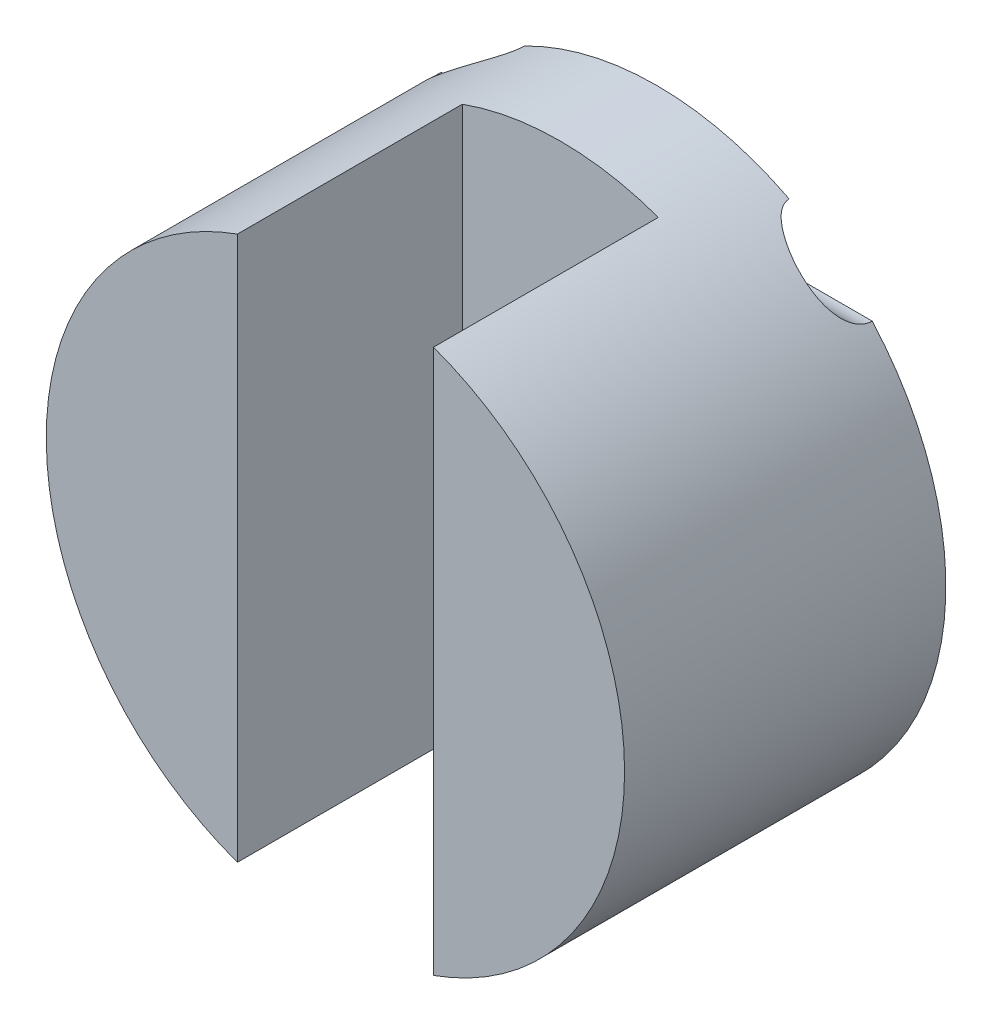
ISO-10303-21;
HEADER;
FILE_DESCRIPTION(('STEP AP214'),'2;1');
FILE_NAME('part.step','',(''),(''),'','','');
FILE_SCHEMA(('AUTOMOTIVE_DESIGN { 1 0 10303 214 1 1 1 1 }'));
ENDSEC;
DATA;
#1=APPLICATION_CONTEXT('core data for automotive mechanical design processes');
#2=APPLICATION_PROTOCOL_DEFINITION('international standard','automotive_design',2000,#1);
#3=PRODUCT_CONTEXT('',#1,'mechanical');
#4=PRODUCT('Part','Part','',(#3));
#5=PRODUCT_RELATED_PRODUCT_CATEGORY('part','',(#4));
#6=PRODUCT_DEFINITION_FORMATION('','',#4);
#7=PRODUCT_DEFINITION_CONTEXT('part definition',#1,'design');
#8=PRODUCT_DEFINITION('design','',#6,#7);
#9=PRODUCT_DEFINITION_SHAPE('','',#8);
#10=(LENGTH_UNIT() NAMED_UNIT(*) SI_UNIT(.MILLI.,.METRE.));
#11=(NAMED_UNIT(*) PLANE_ANGLE_UNIT() SI_UNIT($,.RADIAN.));
#12=(NAMED_UNIT(*) SI_UNIT($,.STERADIAN.) SOLID_ANGLE_UNIT());
#13=UNCERTAINTY_MEASURE_WITH_UNIT(LENGTH_MEASURE(1.E-05),#10,'distance_accuracy_value','');
#14=(GEOMETRIC_REPRESENTATION_CONTEXT(3) GLOBAL_UNCERTAINTY_ASSIGNED_CONTEXT((#13)) GLOBAL_UNIT_ASSIGNED_CONTEXT((#10,
#11,#12)) REPRESENTATION_CONTEXT('',''));
#15=CARTESIAN_POINT('',(0.,0.,0.));
#16=DIRECTION('',(0.,0.,1.));
#17=DIRECTION('',(1.,0.,0.));
#18=AXIS2_PLACEMENT_3D('',#15,#16,#17);
#19=CARTESIAN_POINT('',(0.,0.,0.));
#20=DIRECTION('',(0.,0.,1.));
#21=DIRECTION('',(1.,0.,0.));
#22=AXIS2_PLACEMENT_3D('',#19,#20,#21);
#23=PLANE('',#22);
#24=CARTESIAN_POINT('',(0.,0.,0.));
#25=DIRECTION('',(0.,0.,1.));
#26=DIRECTION('',(1.,0.,0.));
#27=AXIS2_PLACEMENT_3D('',#24,#25,#26);
#28=CIRCLE('',#27,90.);
#29=CARTESIAN_POINT('',(-67.0820393249937,60.,0.));
#30=VERTEX_POINT('',#29);
#31=CARTESIAN_POINT('',(67.0820393249937,60.,0.));
#32=VERTEX_POINT('',#31);
#33=EDGE_CURVE('E101',#30,#32,#28,.T.);
#34=ORIENTED_EDGE('',*,*,#33,.F.);
#35=DIRECTION('',(1.,0.,0.));
#36=VECTOR('',#35,1.);
#37=CARTESIAN_POINT('',(-200.,60.,0.));
#38=LINE('',#37,#36);
#39=EDGE_CURVE('E11',#30,#32,#38,.T.);
#40=ORIENTED_EDGE('',*,*,#39,.T.);
#41=EDGE_LOOP('',(#34,#40));
#42=FACE_BOUND('',#41,.T.);
#43=ADVANCED_FACE('F39',(#42),#23,.F.);
#44=CARTESIAN_POINT('',(0.,0.,100.));
#45=DIRECTION('',(0.,0.,1.));
#46=DIRECTION('',(1.,0.,0.));
#47=AXIS2_PLACEMENT_3D('',#44,#45,#46);
#48=PLANE('',#47);
#49=CARTESIAN_POINT('',(0.,0.,100.));
#50=DIRECTION('',(0.,0.,1.));
#51=DIRECTION('',(1.,0.,0.));
#52=AXIS2_PLACEMENT_3D('',#49,#50,#51);
#53=CIRCLE('',#52,90.);
#54=CARTESIAN_POINT('',(-30.5,84.6743762894065,100.));
#55=VERTEX_POINT('',#54);
#56=CARTESIAN_POINT('',(-30.5,-84.6743762894065,100.));
#57=VERTEX_POINT('',#56);
#58=EDGE_CURVE('E107',#55,#57,#53,.T.);
#59=ORIENTED_EDGE('',*,*,#58,.T.);
#60=DIRECTION('',(0.,1.,0.));
#61=VECTOR('',#60,1.);
#62=CARTESIAN_POINT('',(-30.5,-200.,100.));
#63=LINE('',#62,#61);
#64=EDGE_CURVE('E116',#57,#55,#63,.T.);
#65=ORIENTED_EDGE('',*,*,#64,.T.);
#66=EDGE_LOOP('',(#59,#65));
#67=FACE_BOUND('',#66,.T.);
#68=ADVANCED_FACE('F147',(#67),#48,.T.);
#69=CARTESIAN_POINT('',(0.,0.,100.));
#70=DIRECTION('',(0.,0.,-1.));
#71=DIRECTION('',(-1.,0.,0.));
#72=AXIS2_PLACEMENT_3D('',#69,#70,#71);
#73=CYLINDRICAL_SURFACE('',#72,90.);
#74=CARTESIAN_POINT('',(0.,0.,30.));
#75=DIRECTION('',(0.,0.,-1.));
#76=DIRECTION('',(-1.,0.,0.));
#77=AXIS2_PLACEMENT_3D('',#74,#75,#76);
#78=CIRCLE('',#77,90.);
#79=CARTESIAN_POINT('',(-30.5,84.6743762894065,30.));
#80=VERTEX_POINT('',#79);
#81=CARTESIAN_POINT('',(30.5,84.6743762894065,30.));
#82=VERTEX_POINT('',#81);
#83=EDGE_CURVE('E96',#80,#82,#78,.T.);
#84=ORIENTED_EDGE('',*,*,#83,.T.);
#85=DIRECTION('',(0.,0.,-1.));
#86=VECTOR('',#85,1.);
#87=CARTESIAN_POINT('',(30.5,84.6743762894065,100.));
#88=LINE('',#87,#86);
#89=CARTESIAN_POINT('',(30.5,84.6743762894065,100.));
#90=VERTEX_POINT('',#89);
#91=EDGE_CURVE('E142',#82,#90,#88,.F.);
#92=ORIENTED_EDGE('',*,*,#91,.T.);
#93=CARTESIAN_POINT('',(30.5,-84.6743762894065,100.));
#94=VERTEX_POINT('',#93);
#95=EDGE_CURVE('E104',#94,#90,#53,.T.);
#96=ORIENTED_EDGE('',*,*,#95,.F.);
#97=DIRECTION('',(0.,0.,-1.));
#98=VECTOR('',#97,1.);
#99=CARTESIAN_POINT('',(30.5,-84.6743762894065,100.));
#100=LINE('',#99,#98);
#101=CARTESIAN_POINT('',(30.5,-84.6743762894065,30.));
#102=VERTEX_POINT('',#101);
#103=EDGE_CURVE('E109',#94,#102,#100,.T.);
#104=ORIENTED_EDGE('',*,*,#103,.T.);
#105=CARTESIAN_POINT('',(-30.5,-84.6743762894065,30.));
#106=VERTEX_POINT('',#105);
#107=EDGE_CURVE('E114',#102,#106,#78,.T.);
#108=ORIENTED_EDGE('',*,*,#107,.T.);
#109=DIRECTION('',(0.,0.,-1.));
#110=VECTOR('',#109,1.);
#111=CARTESIAN_POINT('',(-30.5,-84.6743762894065,100.));
#112=LINE('',#111,#110);
#113=EDGE_CURVE('E131',#106,#57,#112,.F.);
#114=ORIENTED_EDGE('',*,*,#113,.T.);
#115=ORIENTED_EDGE('',*,*,#58,.F.);
#116=DIRECTION('',(0.,0.,-1.));
#117=VECTOR('',#116,1.);
#118=CARTESIAN_POINT('',(-30.5,84.6743762894065,100.));
#119=LINE('',#118,#117);
#120=EDGE_CURVE('E138',#55,#80,#119,.T.);
#121=ORIENTED_EDGE('',*,*,#120,.T.);
#122=EDGE_LOOP('',(#84,#92,#96,#104,#108,#114,#115,#121));
#123=FACE_BOUND('',#122,.T.);
#124=ORIENTED_EDGE('',*,*,#33,.T.);
#125=CARTESIAN_POINT('',(67.0820393249937,60.,0.));
#126=CARTESIAN_POINT('',(67.0820400660239,59.999998620481,0.114225035064845));
#127=CARTESIAN_POINT('',(67.0802884191229,60.0019576394621,0.228433501595897));
#128=CARTESIAN_POINT('',(67.0732928725613,60.0097777309474,0.456604524815152));
#129=CARTESIAN_POINT('',(67.0680491317635,60.0156386259469,0.570567092453229));
#130=CARTESIAN_POINT('',(67.0471092976049,60.0390340066079,0.911603492596775));
#131=CARTESIAN_POINT('',(67.0262045501936,60.0623812492509,1.1380063555372));
#132=CARTESIAN_POINT('',(66.9710025431974,60.1239261716919,1.58551861329466));
#133=CARTESIAN_POINT('',(66.936795625217,60.1620236677563,1.80665325700858));
#134=CARTESIAN_POINT('',(66.8554698602543,60.2523845081803,2.24360511767028));
#135=CARTESIAN_POINT('',(66.8083498548856,60.3046491234163,2.45942185567403));
#136=CARTESIAN_POINT('',(66.7019458857898,60.4223194101804,2.8838223157085));
#137=CARTESIAN_POINT('',(66.6426881157387,60.4876967777638,3.09242050099975));
#138=CARTESIAN_POINT('',(66.5126497251385,60.6306585796549,3.50178116453596));
#139=CARTESIAN_POINT('',(66.4418640479636,60.7082483703433,3.70254015605266));
#140=CARTESIAN_POINT('',(66.2894893747349,60.8745950680717,4.09543036557693));
#141=CARTESIAN_POINT('',(66.207887624767,60.9633651522508,4.28755103377674));
#142=CARTESIAN_POINT('',(66.0347587869414,61.1508537988421,4.66224428671932));
#143=CARTESIAN_POINT('',(65.9432296840185,61.2495743807288,4.84481492179625));
#144=CARTESIAN_POINT('',(65.7199312905079,61.4892300124375,5.25743915088227));
#145=CARTESIAN_POINT('',(65.5847299811361,61.633482175383,5.48372118769969));
#146=CARTESIAN_POINT('',(65.3001895155557,61.9348707648226,5.91807581664422));
#147=CARTESIAN_POINT('',(65.150846623438,62.0920105944914,6.12614356884472));
#148=CARTESIAN_POINT('',(64.8395395343311,62.4170232415814,6.52415158207974));
#149=CARTESIAN_POINT('',(64.6775598336816,62.5849091962554,6.71406891896552));
#150=CARTESIAN_POINT('',(64.3426902882602,62.9291340757124,7.07567573695657));
#151=CARTESIAN_POINT('',(64.1697999063252,63.1054734165763,7.24736431949172));
#152=CARTESIAN_POINT('',(63.7488787720034,63.5310940928977,7.63304811924041));
#153=CARTESIAN_POINT('',(63.496658608991,63.7832843449085,7.83928289408708));
#154=CARTESIAN_POINT('',(62.9773001015166,64.2961354234377,8.21997508950729));
#155=CARTESIAN_POINT('',(62.7101565686157,64.5567991826231,8.39442136713383));
#156=CARTESIAN_POINT('',(62.1632380397577,65.0836085575994,8.71343788753071));
#157=CARTESIAN_POINT('',(61.8834515347715,65.3497590431126,8.85798021257732));
#158=CARTESIAN_POINT('',(61.3135822902038,65.8847290182724,9.11883264328539));
#159=CARTESIAN_POINT('',(61.0234993834274,66.1535485512083,9.23514229025906));
#160=CARTESIAN_POINT('',(60.3061380692184,66.8094129061907,9.48639518438105));
#161=CARTESIAN_POINT('',(59.8742554253211,67.1968327858514,9.60730307972423));
#162=CARTESIAN_POINT('',(58.9968168879363,67.9685036266233,9.79955210221079));
#163=CARTESIAN_POINT('',(58.5512552797267,68.3527531758029,9.87087221031998));
#164=CARTESIAN_POINT('',(57.6488362909565,69.1155657939003,9.96824550621856));
#165=CARTESIAN_POINT('',(57.1919563763531,69.4941146191259,9.99419954282841));
#166=CARTESIAN_POINT('',(56.2706431033015,70.2422032058557,10.0040621744165));
#167=CARTESIAN_POINT('',(55.8062102154169,70.6117435250482,9.98797337884047));
#168=CARTESIAN_POINT('',(54.7404462158951,71.4426975938115,9.90649650815334));
#169=CARTESIAN_POINT('',(54.1373687759484,71.9007018720126,9.82850953593709));
#170=CARTESIAN_POINT('',(53.2296440355507,72.5723584519497,9.66622939806979));
#171=CARTESIAN_POINT('',(52.9264402235128,72.7937633741896,9.6045554025484));
#172=CARTESIAN_POINT('',(52.3195355805533,73.2311816765751,9.46636584245038));
#173=CARTESIAN_POINT('',(52.0158348055084,73.447195623698,9.3898518461074));
#174=CARTESIAN_POINT('',(51.4089892240517,73.8732231059098,9.22228048059452));
#175=CARTESIAN_POINT('',(51.1058442876157,74.083245451383,9.13124591712652));
#176=CARTESIAN_POINT('',(50.5002840899399,74.4973544805346,8.93455893095835));
#177=CARTESIAN_POINT('',(50.1978687588197,74.7014417551884,8.8289079697365));
#178=CARTESIAN_POINT('',(49.5946308629443,75.1032878740664,8.60288129333098));
#179=CARTESIAN_POINT('',(49.2938074229158,75.3010505834691,8.48251479702558));
#180=CARTESIAN_POINT('',(48.6943647147471,75.6900687617402,8.22662328789124));
#181=CARTESIAN_POINT('',(48.3957455880706,75.8813238157687,8.0910973110518));
#182=CARTESIAN_POINT('',(47.8005496923594,76.2576678207183,7.80370948244807));
#183=CARTESIAN_POINT('',(47.5039857417649,76.442729271287,7.65178490022325));
#184=CARTESIAN_POINT('',(46.9154383579287,76.8053452768251,7.33115609194495));
#185=CARTESIAN_POINT('',(46.6234540119269,76.9829013399643,7.16245526005631));
#186=CARTESIAN_POINT('',(46.0457044534572,77.3298559723198,6.80697486854522));
#187=CARTESIAN_POINT('',(45.7599387743035,77.4992551548421,6.62019667132655));
#188=CARTESIAN_POINT('',(45.1969092507825,77.8289515476804,6.22682941686307));
#189=CARTESIAN_POINT('',(44.9196436027111,77.989250695257,6.02024460152006));
#190=CARTESIAN_POINT('',(44.4449795892877,78.2604540420438,5.63958491867128));
#191=CARTESIAN_POINT('',(44.245003727567,78.3736567493264,5.47036651858896));
#192=CARTESIAN_POINT('',(43.8534693304265,78.59340681766,5.11824783491197));
#193=CARTESIAN_POINT('',(43.6619123131875,78.6999529797761,4.93534509954372));
#194=CARTESIAN_POINT('',(43.2900296373246,78.9051224181552,4.55471919619959));
#195=CARTESIAN_POINT('',(43.1096896749057,79.0037558331697,4.3570156420305));
#196=CARTESIAN_POINT('',(42.7635829151964,79.1916330209633,3.94526262625944));
#197=CARTESIAN_POINT('',(42.5978063065661,79.2808831233864,3.73122435387198));
#198=CARTESIAN_POINT('',(42.2640455471191,79.4593658512651,3.25476832193036));
#199=CARTESIAN_POINT('',(42.098818087559,79.5469505913296,2.98972768149801));
#200=CARTESIAN_POINT('',(41.8769648435927,79.663836583702,2.57502879402555));
#201=CARTESIAN_POINT('',(41.8074512692724,79.7003284428864,2.43421954749586));
#202=CARTESIAN_POINT('',(41.6782844075574,79.7679503416652,2.14684159247524));
#203=CARTESIAN_POINT('',(41.6186314522315,79.7990802006889,2.00027269022629));
#204=CARTESIAN_POINT('',(41.5119934374888,79.8546050268747,1.70548919647641));
#205=CARTESIAN_POINT('',(41.4647354604286,79.8791454369535,1.55740142318812));
#206=CARTESIAN_POINT('',(41.3823806351003,79.9218412772265,1.25701239696542));
#207=CARTESIAN_POINT('',(41.347279126666,79.9399991541964,1.10471278286617));
#208=CARTESIAN_POINT('',(41.2899987767469,79.969601254671,0.79471195601189));
#209=CARTESIAN_POINT('',(41.268015559652,79.9809438629328,0.636964380509906));
#210=CARTESIAN_POINT('',(41.2384828026067,79.9961723982912,0.319501413289932));
#211=CARTESIAN_POINT('',(41.2309583730552,80.0000453529751,0.159783082090832));
#212=CARTESIAN_POINT('',(41.2310562561767,80.,0.));
#213=B_SPLINE_CURVE_WITH_KNOTS('',3,(#125,#126,#127,#128,#129,#130,#131,#132,#133,#134,#135,
#136,#137,#138,#139,#140,#141,#142,#143,#144,#145,#146,#147,#148,#149,#150,#151,#152,#153,#154,
#155,#156,#157,#158,#159,#160,#161,#162,#163,#164,#165,#166,#167,#168,#169,#170,#171,#172,#173,
#174,#175,#176,#177,#178,#179,#180,#181,#182,#183,#184,#185,#186,#187,#188,#189,#190,#191,#192,
#193,#194,#195,#196,#197,#198,#199,#200,#201,#202,#203,#204,#205,#206,#207,#208,#209,#210,#211,
#212),.UNSPECIFIED.,.F.,.F.,(4,2,2,2,2,2,2,2,2,2,2,2,2,2,2,2,2,2,2,2,2,2,2,2,2,2,2,2,2,2,2,2,2,
2,2,2,2,2,2,2,2,2,2,4),(0.,0.34261207253373,0.685208559976934,1.36986259177066,2.04994579862668,
2.73009003326566,3.40878167365123,4.08777182262783,4.76756985523044,5.44750613314114,
6.34765053716123,7.24803340740943,8.14953884360003,9.05108869808257,10.2852495692864,
11.5198422270393,12.7555823255498,13.9913424994128,15.7666338948827,17.5426773343773,
19.3225976279864,21.1024074510362,23.3830595867078,24.5242157378038,25.6652513615902,
26.8045122315468,27.9436592702204,29.0820962867163,30.2206057390608,31.3636360474641,
32.50643556707,33.6491490263587,34.7916182997722,35.6473050904633,36.5031455603421,
37.3578713037332,38.2120167298134,39.1821407996878,39.6653935365124,40.1486625441692,
40.6201726648311,41.0915018321148,41.569694534421,42.0487169602061),.UNSPECIFIED.);
#214=CARTESIAN_POINT('',(41.2310562561767,80.,0.));
#215=VERTEX_POINT('',#214);
#216=EDGE_CURVE('E95',#32,#215,#213,.T.);
#217=ORIENTED_EDGE('',*,*,#216,.T.);
#218=CARTESIAN_POINT('',(-41.2310562561767,80.,0.));
#219=VERTEX_POINT('',#218);
#220=EDGE_CURVE('E97',#215,#219,#28,.T.);
#221=ORIENTED_EDGE('',*,*,#220,.T.);
#222=CARTESIAN_POINT('',(-41.2310562561767,80.,0.));
#223=CARTESIAN_POINT('',(-41.2309934223305,80.0000291109476,0.142292686186409));
#224=CARTESIAN_POINT('',(-41.2369466310305,79.9969641221751,0.284548111703229));
#225=CARTESIAN_POINT('',(-41.260402143724,79.9848706131342,0.567673129081295));
#226=CARTESIAN_POINT('',(-41.2778898499346,79.9758496306139,0.708544244486921));
#227=CARTESIAN_POINT('',(-41.3236492760466,79.9522146207502,0.986229192660772));
#228=CARTESIAN_POINT('',(-41.3517851487204,79.9376710420597,1.1230716467204));
#229=CARTESIAN_POINT('',(-41.4180685033846,79.903347868885,1.39366603921261));
#230=CARTESIAN_POINT('',(-41.4562196229713,79.8835663719356,1.5274168354929));
#231=CARTESIAN_POINT('',(-41.5531315576692,79.8332072668629,1.82670516266522));
#232=CARTESIAN_POINT('',(-41.614675760115,79.8011568425857,1.99109508693105));
#233=CARTESIAN_POINT('',(-41.7504565193788,79.7302028332602,2.31308767695858));
#234=CARTESIAN_POINT('',(-41.8247028236871,79.6912939844117,2.47068501299107));
#235=CARTESIAN_POINT('',(-41.9843230878408,79.6073161032318,2.77942444700185));
#236=CARTESIAN_POINT('',(-42.069749973833,79.5622177183564,2.93053098934989));
#237=CARTESIAN_POINT('',(-42.2496742088051,79.4668195846048,3.22542054758093));
#238=CARTESIAN_POINT('',(-42.3441695839076,79.416520967445,3.3692051468003));
#239=CARTESIAN_POINT('',(-42.6054617098821,79.2767852172252,3.74205777273961));
#240=CARTESIAN_POINT('',(-42.7789173749531,79.1833736242174,3.96498415626675));
#241=CARTESIAN_POINT('',(-43.1413857406401,78.9864765771794,4.39303856105857));
#242=CARTESIAN_POINT('',(-43.3304092170238,78.8829841361534,4.59815404872315));
#243=CARTESIAN_POINT('',(-43.7203289065219,78.6675442419709,4.99241181914899));
#244=CARTESIAN_POINT('',(-43.9212379146695,78.5555876395646,5.18153633517056));
#245=CARTESIAN_POINT('',(-44.3320202475281,78.3245016764642,5.54518658955881));
#246=CARTESIAN_POINT('',(-44.5418968928265,78.2053696520073,5.71970684815895));
#247=CARTESIAN_POINT('',(-44.9578111944897,77.9669787381957,6.04699436875872));
#248=CARTESIAN_POINT('',(-45.1635138455109,77.8480256106313,6.20041354361387));
#249=CARTESIAN_POINT('',(-45.5797649313327,77.6050456257622,6.49614462645914));
#250=CARTESIAN_POINT('',(-45.7903126415054,77.4810195250424,6.63845818160546));
#251=CARTESIAN_POINT('',(-46.2154341411252,77.2281998479494,6.91288365075791));
#252=CARTESIAN_POINT('',(-46.4300109263704,77.0994026487443,7.04498756724807));
#253=CARTESIAN_POINT('',(-46.8622487432627,76.8374489682328,7.29949454270935));
#254=CARTESIAN_POINT('',(-47.0799101219768,76.704291994136,7.42189649967062));
#255=CARTESIAN_POINT('',(-47.7373936104566,76.2981436005104,7.7757757221572));
#256=CARTESIAN_POINT('',(-48.1809035561795,76.0189562798237,7.99340984790949));
#257=CARTESIAN_POINT('',(-49.0735453410805,75.4457992562794,8.39437159264375));
#258=CARTESIAN_POINT('',(-49.5226759032869,75.1518328669382,8.57770685840895));
#259=CARTESIAN_POINT('',(-50.2741021868027,74.6501545257922,8.85600115871079));
#260=CARTESIAN_POINT('',(-50.5755917989837,74.446244451497,8.96008206072248));
#261=CARTESIAN_POINT('',(-51.1792217685845,74.0325685685339,9.15371736875341));
#262=CARTESIAN_POINT('',(-51.4813621596649,73.8228024499147,9.24327100415215));
#263=CARTESIAN_POINT('',(-52.3880436140814,73.1849611506704,9.49021332774739));
#264=CARTESIAN_POINT('',(-52.9927326085011,72.7484179166268,9.62584202441259));
#265=CARTESIAN_POINT('',(-54.196805305428,71.8558799511855,9.83695432346602));
#266=CARTESIAN_POINT('',(-54.7961953244967,71.3999137346666,9.91252309741549));
#267=CARTESIAN_POINT('',(-55.9860488788765,70.470782218077,9.99979712845465));
#268=CARTESIAN_POINT('',(-56.5765170432115,69.99762630323,10.011536722748));
#269=CARTESIAN_POINT('',(-57.5536851264158,69.1941726921375,9.97274042779765));
#270=CARTESIAN_POINT('',(-57.9441715976591,68.8674871264889,9.94122527180783));
#271=CARTESIAN_POINT('',(-58.7171503883488,68.209629681846,9.84404080797369));
#272=CARTESIAN_POINT('',(-59.0996428573917,67.8784578869967,9.77837213986076));
#273=CARTESIAN_POINT('',(-59.8539637597739,67.2142490704432,9.6102450147125));
#274=CARTESIAN_POINT('',(-60.2258054921329,66.8812150564178,9.50783480963634));
#275=CARTESIAN_POINT('',(-60.9566866294279,66.2157556205556,9.26310512939506));
#276=CARTESIAN_POINT('',(-61.3157300806229,65.8833300384628,9.12079839620356));
#277=CARTESIAN_POINT('',(-61.9208803083468,65.3140608599588,8.83816705140133));
#278=CARTESIAN_POINT('',(-62.1708117185443,65.0761547373536,8.70813159512344));
#279=CARTESIAN_POINT('',(-62.6608094267294,64.6044774412756,8.42402086065315));
#280=CARTESIAN_POINT('',(-62.9008759870797,64.3707061579282,8.2699462223233));
#281=CARTESIAN_POINT('',(-63.3691536180385,63.9097663372074,7.93661649731635));
#282=CARTESIAN_POINT('',(-63.597374885059,63.6825921978055,7.7573835763162));
#283=CARTESIAN_POINT('',(-64.0400680024502,63.2373950901866,7.37249637957563));
#284=CARTESIAN_POINT('',(-64.2545436354611,63.0193696101156,7.16684941987826));
#285=CARTESIAN_POINT('',(-64.6176771747007,62.6466786941226,6.78102482355102));
#286=CARTESIAN_POINT('',(-64.7697641594313,62.4893799916475,6.60660617756043));
#287=CARTESIAN_POINT('',(-65.0633627566255,62.1836289365818,6.24187017949052));
#288=CARTESIAN_POINT('',(-65.204877020744,62.0351743677739,6.05155683935676));
#289=CARTESIAN_POINT('',(-65.4759175918412,61.7490327012508,5.65519589825045));
#290=CARTESIAN_POINT('',(-65.605452417243,61.6113379633313,5.44915967088827));
#291=CARTESIAN_POINT('',(-65.8511849114336,61.3486250418723,5.02161581274783));
#292=CARTESIAN_POINT('',(-65.9673849866525,61.2236045715719,4.80011098512304));
#293=CARTESIAN_POINT('',(-66.1663929690381,61.0084102990782,4.38142592638436));
#294=CARTESIAN_POINT('',(-66.2515172254814,60.9159283292289,4.18652973018672));
#295=CARTESIAN_POINT('',(-66.4106575052299,60.742394015474,3.78735644898964));
#296=CARTESIAN_POINT('',(-66.484675805271,60.6613393291663,3.58308129793323));
#297=CARTESIAN_POINT('',(-66.6206705528041,60.5119529876133,3.16636889391771));
#298=CARTESIAN_POINT('',(-66.6826630205246,60.4436044110412,2.95394295751295));
#299=CARTESIAN_POINT('',(-66.793932016195,60.3206228145942,2.52191732046285));
#300=CARTESIAN_POINT('',(-66.8432109573433,60.2659871918698,2.3023189901628));
#301=CARTESIAN_POINT('',(-66.9180767028548,60.1828325064433,1.91127320409118));
#302=CARTESIAN_POINT('',(-66.9465110593183,60.1511928599219,1.74102337416139));
#303=CARTESIAN_POINT('',(-66.9954477938968,60.0966830405396,1.39802004044536));
#304=CARTESIAN_POINT('',(-67.0159517374338,60.0738111369802,1.22526703776426));
#305=CARTESIAN_POINT('',(-67.0488924935903,60.0370440823063,0.877569136596811));
#306=CARTESIAN_POINT('',(-67.06130744088,60.0231732623858,0.702619589440734));
#307=CARTESIAN_POINT('',(-67.0778889046958,60.0046401965607,0.351783011293322));
#308=CARTESIAN_POINT('',(-67.0820524991947,59.9999812128177,0.175895670304776));
#309=CARTESIAN_POINT('',(-67.0820393249937,60.,0.));
#310=B_SPLINE_CURVE_WITH_KNOTS('',3,(#222,#223,#224,#225,#226,#227,#228,#229,#230,#231,#232,
#233,#234,#235,#236,#237,#238,#239,#240,#241,#242,#243,#244,#245,#246,#247,#248,#249,#250,#251,
#252,#253,#254,#255,#256,#257,#258,#259,#260,#261,#262,#263,#264,#265,#266,#267,#268,#269,#270,
#271,#272,#273,#274,#275,#276,#277,#278,#279,#280,#281,#282,#283,#284,#285,#286,#287,#288,#289,
#290,#291,#292,#293,#294,#295,#296,#297,#298,#299,#300,#301,#302,#303,#304,#305,#306,#307,#308,
#309),.UNSPECIFIED.,.F.,.F.,(4,2,2,2,2,2,2,2,2,2,2,2,2,2,2,2,2,2,2,2,2,2,2,2,2,2,2,2,2,2,2,2,2,
2,2,2,2,2,2,2,2,2,2,4),(0.,0.426661148264799,0.852783357859818,1.27364305733434,
1.69465582751007,2.22912921851404,2.76401461508028,3.30153037799494,3.83892940766819,
4.72996069488493,5.62161400718855,6.51424531637328,7.40721006815096,8.25540892406545,
9.10348173731226,9.95221227625675,10.8010390816374,12.5019117446118,14.2024047522701,
15.3377695295276,16.4731945142203,18.7444668950719,21.0125125865372,23.2793380514796,
24.8085659046742,26.3377651148465,27.8649633643645,29.3916744187258,30.4970957121206,
31.6024875869993,32.7069116002471,33.8110303720291,34.6497636100742,35.4882857813908,
36.3262070305154,37.1639768272069,37.859034927366,38.5539503444344,39.2479335742328,
39.9417849795976,40.4678487840081,40.9938086931173,41.5211844878547,42.0487470072719),.UNSPECIFIED.);
#311=EDGE_CURVE('E54',#219,#30,#310,.T.);
#312=ORIENTED_EDGE('',*,*,#311,.T.);
#313=EDGE_LOOP('',(#124,#217,#221,#312));
#314=FACE_BOUND('',#313,.T.);
#315=ADVANCED_FACE('F41',(#123,#314),#73,.T.);
#316=DIRECTION('',(0.,1.,0.));
#317=VECTOR('',#316,1.);
#318=CARTESIAN_POINT('',(30.5,-200.,100.));
#319=LINE('',#318,#317);
#320=EDGE_CURVE('E113',#94,#90,#319,.T.);
#321=ORIENTED_EDGE('',*,*,#320,.F.);
#322=ORIENTED_EDGE('',*,*,#95,.T.);
#323=EDGE_LOOP('',(#321,#322));
#324=FACE_BOUND('',#323,.T.);
#325=ADVANCED_FACE('F150',(#324),#48,.T.);
#326=ORIENTED_EDGE('',*,*,#220,.F.);
#327=DIRECTION('',(1.,0.,0.));
#328=VECTOR('',#327,1.);
#329=CARTESIAN_POINT('',(-200.,80.,0.));
#330=LINE('',#329,#328);
#331=EDGE_CURVE('E48',#215,#219,#330,.F.);
#332=ORIENTED_EDGE('',*,*,#331,.T.);
#333=EDGE_LOOP('',(#326,#332));
#334=FACE_BOUND('',#333,.T.);
#335=ADVANCED_FACE('F102',(#334),#23,.F.);
#336=CARTESIAN_POINT('',(-30.5,-200.,30.));
#337=DIRECTION('',(0.,0.,-1.));
#338=DIRECTION('',(-1.,0.,0.));
#339=AXIS2_PLACEMENT_3D('',#336,#337,#338);
#340=PLANE('',#339);
#341=DIRECTION('',(0.,1.,0.));
#342=VECTOR('',#341,1.);
#343=CARTESIAN_POINT('',(-30.5,-200.,30.));
#344=LINE('',#343,#342);
#345=EDGE_CURVE('E62',#106,#80,#344,.T.);
#346=ORIENTED_EDGE('',*,*,#345,.F.);
#347=ORIENTED_EDGE('',*,*,#107,.F.);
#348=DIRECTION('',(0.,1.,0.));
#349=VECTOR('',#348,1.);
#350=CARTESIAN_POINT('',(30.5,-200.,30.));
#351=LINE('',#350,#349);
#352=EDGE_CURVE('E105',#102,#82,#351,.T.);
#353=ORIENTED_EDGE('',*,*,#352,.T.);
#354=ORIENTED_EDGE('',*,*,#83,.F.);
#355=EDGE_LOOP('',(#346,#347,#353,#354));
#356=FACE_BOUND('',#355,.T.);
#357=ADVANCED_FACE('F156',(#356),#340,.F.);
#358=CARTESIAN_POINT('',(30.5,-200.,100.));
#359=DIRECTION('',(1.,0.,0.));
#360=DIRECTION('',(0.,0.,-1.));
#361=AXIS2_PLACEMENT_3D('',#358,#359,#360);
#362=PLANE('',#361);
#363=ORIENTED_EDGE('',*,*,#320,.T.);
#364=ORIENTED_EDGE('',*,*,#91,.F.);
#365=ORIENTED_EDGE('',*,*,#352,.F.);
#366=ORIENTED_EDGE('',*,*,#103,.F.);
#367=EDGE_LOOP('',(#363,#364,#365,#366));
#368=FACE_BOUND('',#367,.T.);
#369=ADVANCED_FACE('F144',(#368),#362,.F.);
#370=CARTESIAN_POINT('',(-30.5,-200.,100.));
#371=DIRECTION('',(-1.,0.,0.));
#372=DIRECTION('',(0.,0.,1.));
#373=AXIS2_PLACEMENT_3D('',#370,#371,#372);
#374=PLANE('',#373);
#375=ORIENTED_EDGE('',*,*,#64,.F.);
#376=ORIENTED_EDGE('',*,*,#113,.F.);
#377=ORIENTED_EDGE('',*,*,#345,.T.);
#378=ORIENTED_EDGE('',*,*,#120,.F.);
#379=EDGE_LOOP('',(#375,#376,#377,#378));
#380=FACE_BOUND('',#379,.T.);
#381=ADVANCED_FACE('F174',(#380),#374,.F.);
#382=CARTESIAN_POINT('',(-200.,70.,0.));
#383=DIRECTION('',(1.,0.,0.));
#384=DIRECTION('',(0.,0.,-1.));
#385=AXIS2_PLACEMENT_3D('',#382,#383,#384);
#386=CYLINDRICAL_SURFACE('',#385,10.);
#387=ORIENTED_EDGE('',*,*,#311,.F.);
#388=ORIENTED_EDGE('',*,*,#331,.F.);
#389=ORIENTED_EDGE('',*,*,#216,.F.);
#390=ORIENTED_EDGE('',*,*,#39,.F.);
#391=EDGE_LOOP('',(#387,#388,#389,#390));
#392=FACE_BOUND('',#391,.T.);
#393=ADVANCED_FACE('F93',(#392),#386,.F.);
#394=CLOSED_SHELL('',(#43,#68,#315,#325,#335,#357,#369,#381,#393));
#395=MANIFOLD_SOLID_BREP('B2',#394);
#396=ADVANCED_BREP_SHAPE_REPRESENTATION('',(#18,#395),#14);
#397=SHAPE_DEFINITION_REPRESENTATION(#9,#396);
ENDSEC;
END-ISO-10303-21;
